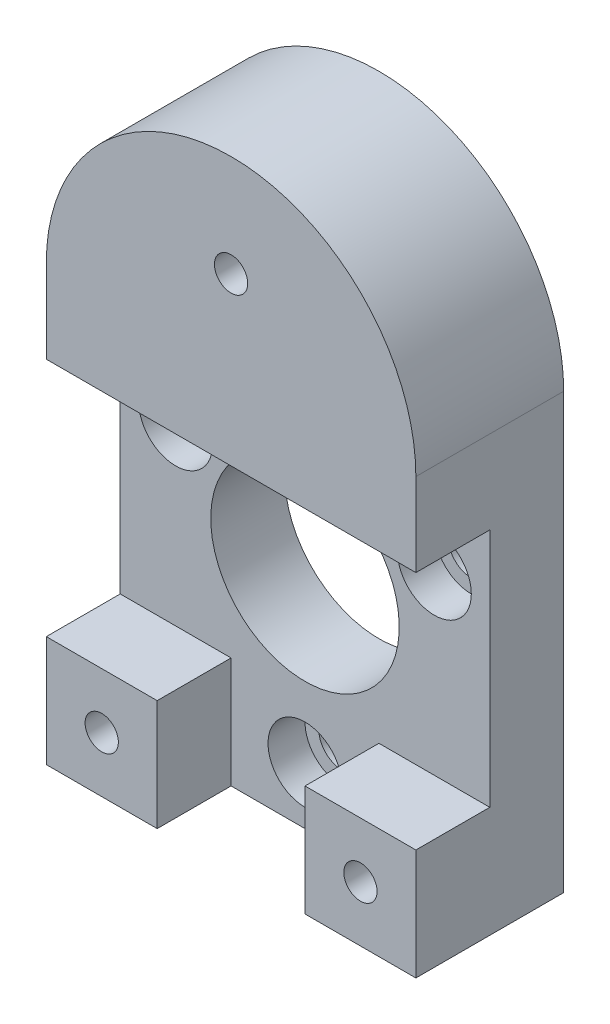
ISO-10303-21;
HEADER;
FILE_DESCRIPTION(('STEP AP214'),'2;1');
FILE_NAME('part.step','',(''),(''),'','','');
FILE_SCHEMA(('AUTOMOTIVE_DESIGN { 1 0 10303 214 1 1 1 1 }'));
ENDSEC;
DATA;
#1=APPLICATION_CONTEXT('core data for automotive mechanical design processes');
#2=APPLICATION_PROTOCOL_DEFINITION('international standard','automotive_design',2000,#1);
#3=PRODUCT_CONTEXT('',#1,'mechanical');
#4=PRODUCT('Part','Part','',(#3));
#5=PRODUCT_RELATED_PRODUCT_CATEGORY('part','',(#4));
#6=PRODUCT_DEFINITION_FORMATION('','',#4);
#7=PRODUCT_DEFINITION_CONTEXT('part definition',#1,'design');
#8=PRODUCT_DEFINITION('design','',#6,#7);
#9=PRODUCT_DEFINITION_SHAPE('','',#8);
#10=(LENGTH_UNIT() NAMED_UNIT(*) SI_UNIT(.MILLI.,.METRE.));
#11=(NAMED_UNIT(*) PLANE_ANGLE_UNIT() SI_UNIT($,.RADIAN.));
#12=(NAMED_UNIT(*) SI_UNIT($,.STERADIAN.) SOLID_ANGLE_UNIT());
#13=UNCERTAINTY_MEASURE_WITH_UNIT(LENGTH_MEASURE(1.E-05),#10,'distance_accuracy_value','');
#14=(GEOMETRIC_REPRESENTATION_CONTEXT(3) GLOBAL_UNCERTAINTY_ASSIGNED_CONTEXT((#13)) GLOBAL_UNIT_ASSIGNED_CONTEXT((#10,
#11,#12)) REPRESENTATION_CONTEXT('',''));
#15=CARTESIAN_POINT('',(0.,0.,0.));
#16=DIRECTION('',(0.,0.,1.));
#17=DIRECTION('',(1.,0.,0.));
#18=AXIS2_PLACEMENT_3D('',#15,#16,#17);
#19=CARTESIAN_POINT('',(0.,0.,28.));
#20=DIRECTION('',(0.,0.,-1.));
#21=DIRECTION('',(1.,0.,0.));
#22=AXIS2_PLACEMENT_3D('',#19,#20,#21);
#23=PLANE('',#22);
#24=CARTESIAN_POINT('',(0.,-9.,28.));
#25=DIRECTION('',(0.,0.,1.));
#26=DIRECTION('',(1.,0.,0.));
#27=AXIS2_PLACEMENT_3D('',#24,#25,#26);
#28=CIRCLE('',#27,2.);
#29=CARTESIAN_POINT('',(2.,-9.,28.));
#30=VERTEX_POINT('',#29);
#31=EDGE_CURVE('E351',#30,#30,#28,.T.);
#32=ORIENTED_EDGE('',*,*,#31,.F.);
#33=EDGE_LOOP('',(#32));
#34=FACE_BOUND('',#33,.T.);
#35=CARTESIAN_POINT('',(7.,3.49999999999994,28.));
#36=DIRECTION('',(0.,0.,1.));
#37=DIRECTION('',(1.,0.,0.));
#38=AXIS2_PLACEMENT_3D('',#35,#36,#37);
#39=CIRCLE('',#38,2.);
#40=CARTESIAN_POINT('',(9.,3.49999999999994,28.));
#41=VERTEX_POINT('',#40);
#42=EDGE_CURVE('E347',#41,#41,#39,.T.);
#43=ORIENTED_EDGE('',*,*,#42,.F.);
#44=EDGE_LOOP('',(#43));
#45=FACE_BOUND('',#44,.T.);
#46=CARTESIAN_POINT('',(-7.,3.49999999999994,28.));
#47=DIRECTION('',(0.,0.,1.));
#48=DIRECTION('',(1.,0.,0.));
#49=AXIS2_PLACEMENT_3D('',#46,#47,#48);
#50=CIRCLE('',#49,2.);
#51=CARTESIAN_POINT('',(-5.,3.49999999999994,28.));
#52=VERTEX_POINT('',#51);
#53=EDGE_CURVE('E344',#52,#52,#50,.T.);
#54=ORIENTED_EDGE('',*,*,#53,.F.);
#55=EDGE_LOOP('',(#54));
#56=FACE_BOUND('',#55,.T.);
#57=DIRECTION('',(-1.,0.,0.));
#58=VECTOR('',#57,1.);
#59=CARTESIAN_POINT('',(-10.,6.99999999999994,28.));
#60=LINE('',#59,#58);
#61=CARTESIAN_POINT('',(10.,6.99999999999994,28.));
#62=VERTEX_POINT('',#61);
#63=CARTESIAN_POINT('',(7.21110255092378,6.99999999999994,28.));
#64=VERTEX_POINT('',#63);
#65=EDGE_CURVE('E291',#62,#64,#60,.T.);
#66=ORIENTED_EDGE('',*,*,#65,.T.);
#67=CARTESIAN_POINT('',(0.,11.4999999999999,28.));
#68=DIRECTION('',(0.,0.,1.));
#69=DIRECTION('',(1.,0.,0.));
#70=AXIS2_PLACEMENT_3D('',#67,#68,#69);
#71=CIRCLE('',#70,8.49999999999644);
#72=CARTESIAN_POINT('',(3.46780218363991,3.73956521739389,28.));
#73=VERTEX_POINT('',#72);
#74=EDGE_CURVE('E298',#73,#64,#71,.T.);
#75=ORIENTED_EDGE('',*,*,#74,.F.);
#76=CARTESIAN_POINT('',(0.,0.,28.));
#77=DIRECTION('',(0.,0.,1.));
#78=DIRECTION('',(1.,0.,0.));
#79=AXIS2_PLACEMENT_3D('',#76,#77,#78);
#80=CIRCLE('',#79,5.1);
#81=CARTESIAN_POINT('',(-3.46780218363991,3.73956521739389,28.));
#82=VERTEX_POINT('',#81);
#83=EDGE_CURVE('E296',#82,#73,#80,.T.);
#84=ORIENTED_EDGE('',*,*,#83,.F.);
#85=CARTESIAN_POINT('',(-7.21110255092379,6.99999999999994,28.));
#86=VERTEX_POINT('',#85);
#87=EDGE_CURVE('E278',#86,#82,#71,.T.);
#88=ORIENTED_EDGE('',*,*,#87,.F.);
#89=CARTESIAN_POINT('',(-10.,6.99999999999994,28.));
#90=VERTEX_POINT('',#89);
#91=EDGE_CURVE('E287',#86,#90,#60,.T.);
#92=ORIENTED_EDGE('',*,*,#91,.T.);
#93=DIRECTION('',(0.,1.,0.));
#94=VECTOR('',#93,1.);
#95=CARTESIAN_POINT('',(-10.,11.4999999999999,28.));
#96=LINE('',#95,#94);
#97=CARTESIAN_POINT('',(-10.,-6.,28.));
#98=VERTEX_POINT('',#97);
#99=EDGE_CURVE('E348',#98,#90,#96,.T.);
#100=ORIENTED_EDGE('',*,*,#99,.F.);
#101=DIRECTION('',(-1.,0.,0.));
#102=VECTOR('',#101,1.);
#103=CARTESIAN_POINT('',(-10.,-6.,28.));
#104=LINE('',#103,#102);
#105=CARTESIAN_POINT('',(-4.,-6.00000000000001,28.));
#106=VERTEX_POINT('',#105);
#107=EDGE_CURVE('E419',#106,#98,#104,.T.);
#108=ORIENTED_EDGE('',*,*,#107,.F.);
#109=DIRECTION('',(0.,-1.,0.));
#110=VECTOR('',#109,1.);
#111=CARTESIAN_POINT('',(-4.,0.,28.));
#112=LINE('',#111,#110);
#113=CARTESIAN_POINT('',(-4.,-12.,28.));
#114=VERTEX_POINT('',#113);
#115=EDGE_CURVE('E358',#106,#114,#112,.T.);
#116=ORIENTED_EDGE('',*,*,#115,.T.);
#117=DIRECTION('',(-1.,0.,0.));
#118=VECTOR('',#117,1.);
#119=CARTESIAN_POINT('',(0.,-12.,28.));
#120=LINE('',#119,#118);
#121=CARTESIAN_POINT('',(4.,-12.,28.));
#122=VERTEX_POINT('',#121);
#123=EDGE_CURVE('E378',#122,#114,#120,.T.);
#124=ORIENTED_EDGE('',*,*,#123,.F.);
#125=DIRECTION('',(0.,-1.,0.));
#126=VECTOR('',#125,1.);
#127=CARTESIAN_POINT('',(4.,0.,28.));
#128=LINE('',#127,#126);
#129=CARTESIAN_POINT('',(4.,-6.,28.));
#130=VERTEX_POINT('',#129);
#131=EDGE_CURVE('E374',#130,#122,#128,.T.);
#132=ORIENTED_EDGE('',*,*,#131,.F.);
#133=CARTESIAN_POINT('',(10.,-6.,28.));
#134=VERTEX_POINT('',#133);
#135=EDGE_CURVE('E416',#134,#130,#104,.T.);
#136=ORIENTED_EDGE('',*,*,#135,.F.);
#137=DIRECTION('',(0.,-1.,0.));
#138=VECTOR('',#137,1.);
#139=CARTESIAN_POINT('',(10.,11.4999999999999,28.));
#140=LINE('',#139,#138);
#141=EDGE_CURVE('E404',#62,#134,#140,.T.);
#142=ORIENTED_EDGE('',*,*,#141,.F.);
#143=EDGE_LOOP('',(#66,#75,#84,#88,#92,#100,#108,#116,#124,#132,#136,#142));
#144=FACE_BOUND('',#143,.T.);
#145=ADVANCED_FACE('F157',(#34,#45,#56,#144),#23,.F.);
#146=CARTESIAN_POINT('',(-10.,-6.,52.8806130178211));
#147=DIRECTION('',(0.,-1.,0.));
#148=DIRECTION('',(1.,0.,0.));
#149=AXIS2_PLACEMENT_3D('',#146,#147,#148);
#150=PLANE('',#149);
#151=DIRECTION('',(0.,0.,1.));
#152=VECTOR('',#151,1.);
#153=CARTESIAN_POINT('',(-4.,-6.00000000000001,18.));
#154=LINE('',#153,#152);
#155=CARTESIAN_POINT('',(-4.,-6.00000000000001,32.));
#156=VERTEX_POINT('',#155);
#157=EDGE_CURVE('E372',#106,#156,#154,.T.);
#158=ORIENTED_EDGE('',*,*,#157,.F.);
#159=ORIENTED_EDGE('',*,*,#107,.T.);
#160=DIRECTION('',(0.,0.,-1.));
#161=VECTOR('',#160,1.);
#162=CARTESIAN_POINT('',(-10.,-6.,52.8806130178211));
#163=LINE('',#162,#161);
#164=CARTESIAN_POINT('',(-10.,-6.,32.));
#165=VERTEX_POINT('',#164);
#166=EDGE_CURVE('E410',#165,#98,#163,.T.);
#167=ORIENTED_EDGE('',*,*,#166,.F.);
#168=DIRECTION('',(-1.,0.,0.));
#169=VECTOR('',#168,1.);
#170=CARTESIAN_POINT('',(-10.,-6.,32.));
#171=LINE('',#170,#169);
#172=EDGE_CURVE('E396',#156,#165,#171,.T.);
#173=ORIENTED_EDGE('',*,*,#172,.F.);
#174=EDGE_LOOP('',(#158,#159,#167,#173));
#175=FACE_BOUND('',#174,.T.);
#176=ADVANCED_FACE('F459',(#175),#150,.F.);
#177=CARTESIAN_POINT('',(0.,0.,32.));
#178=DIRECTION('',(0.,0.,-1.));
#179=DIRECTION('',(1.,0.,0.));
#180=AXIS2_PLACEMENT_3D('',#177,#178,#179);
#181=PLANE('',#180);
#182=CARTESIAN_POINT('',(-7.,-9.,32.));
#183=DIRECTION('',(0.,0.,-1.));
#184=DIRECTION('',(-1.,0.,0.));
#185=AXIS2_PLACEMENT_3D('',#182,#183,#184);
#186=CIRCLE('',#185,0.900000000000001);
#187=CARTESIAN_POINT('',(-7.9,-9.,32.));
#188=VERTEX_POINT('',#187);
#189=EDGE_CURVE('E516',#188,#188,#186,.T.);
#190=ORIENTED_EDGE('',*,*,#189,.T.);
#191=EDGE_LOOP('',(#190));
#192=FACE_BOUND('',#191,.T.);
#193=DIRECTION('',(0.,-1.,0.));
#194=VECTOR('',#193,1.);
#195=CARTESIAN_POINT('',(-4.,0.,32.));
#196=LINE('',#195,#194);
#197=CARTESIAN_POINT('',(-4.,-12.,32.));
#198=VERTEX_POINT('',#197);
#199=EDGE_CURVE('E368',#156,#198,#196,.T.);
#200=ORIENTED_EDGE('',*,*,#199,.F.);
#201=ORIENTED_EDGE('',*,*,#172,.T.);
#202=DIRECTION('',(0.,-1.,0.));
#203=VECTOR('',#202,1.);
#204=CARTESIAN_POINT('',(-10.,-6.,32.));
#205=LINE('',#204,#203);
#206=CARTESIAN_POINT('',(-10.,-12.,32.));
#207=VERTEX_POINT('',#206);
#208=EDGE_CURVE('E401',#165,#207,#205,.T.);
#209=ORIENTED_EDGE('',*,*,#208,.T.);
#210=DIRECTION('',(1.,0.,0.));
#211=VECTOR('',#210,1.);
#212=CARTESIAN_POINT('',(-10.,-12.,32.));
#213=LINE('',#212,#211);
#214=EDGE_CURVE('E397',#207,#198,#213,.T.);
#215=ORIENTED_EDGE('',*,*,#214,.T.);
#216=EDGE_LOOP('',(#200,#201,#209,#215));
#217=FACE_BOUND('',#216,.T.);
#218=ADVANCED_FACE('F433',(#192,#217),#181,.F.);
#219=CARTESIAN_POINT('',(0.,0.,24.));
#220=DIRECTION('',(0.,0.,-1.));
#221=DIRECTION('',(1.,0.,0.));
#222=AXIS2_PLACEMENT_3D('',#219,#220,#221);
#223=PLANE('',#222);
#224=CARTESIAN_POINT('',(-7.,-9.,24.));
#225=DIRECTION('',(0.,0.,-1.));
#226=DIRECTION('',(-1.,0.,0.));
#227=AXIS2_PLACEMENT_3D('',#224,#225,#226);
#228=CIRCLE('',#227,0.900000000000001);
#229=CARTESIAN_POINT('',(-7.9,-9.,24.));
#230=VERTEX_POINT('',#229);
#231=EDGE_CURVE('E513',#230,#230,#228,.T.);
#232=ORIENTED_EDGE('',*,*,#231,.F.);
#233=EDGE_LOOP('',(#232));
#234=FACE_BOUND('',#233,.T.);
#235=CARTESIAN_POINT('',(7.,-9.,24.));
#236=DIRECTION('',(0.,0.,-1.));
#237=DIRECTION('',(-1.,0.,0.));
#238=AXIS2_PLACEMENT_3D('',#235,#236,#237);
#239=CIRCLE('',#238,0.899999999999999);
#240=CARTESIAN_POINT('',(6.1,-9.,24.));
#241=VERTEX_POINT('',#240);
#242=EDGE_CURVE('E522',#241,#241,#239,.T.);
#243=ORIENTED_EDGE('',*,*,#242,.F.);
#244=EDGE_LOOP('',(#243));
#245=FACE_BOUND('',#244,.T.);
#246=CARTESIAN_POINT('',(0.,-9.,24.));
#247=DIRECTION('',(0.,0.,-1.));
#248=DIRECTION('',(-1.,0.,0.));
#249=AXIS2_PLACEMENT_3D('',#246,#247,#248);
#250=CIRCLE('',#249,1.25);
#251=CARTESIAN_POINT('',(-1.25,-9.,24.));
#252=VERTEX_POINT('',#251);
#253=EDGE_CURVE('E354',#252,#252,#250,.T.);
#254=ORIENTED_EDGE('',*,*,#253,.F.);
#255=EDGE_LOOP('',(#254));
#256=FACE_BOUND('',#255,.T.);
#257=CARTESIAN_POINT('',(0.,11.4999999999999,24.));
#258=DIRECTION('',(0.,0.,1.));
#259=DIRECTION('',(1.,0.,0.));
#260=AXIS2_PLACEMENT_3D('',#257,#258,#259);
#261=CIRCLE('',#260,8.49999999999644);
#262=CARTESIAN_POINT('',(3.46780218363991,3.73956521739389,24.));
#263=VERTEX_POINT('',#262);
#264=CARTESIAN_POINT('',(-3.46780218363991,3.73956521739389,24.));
#265=VERTEX_POINT('',#264);
#266=EDGE_CURVE('E331',#263,#265,#261,.T.);
#267=ORIENTED_EDGE('',*,*,#266,.T.);
#268=CARTESIAN_POINT('',(0.,0.,24.));
#269=DIRECTION('',(0.,0.,1.));
#270=DIRECTION('',(1.,0.,0.));
#271=AXIS2_PLACEMENT_3D('',#268,#269,#270);
#272=CIRCLE('',#271,5.1);
#273=EDGE_CURVE('E328',#265,#263,#272,.T.);
#274=ORIENTED_EDGE('',*,*,#273,.T.);
#275=EDGE_LOOP('',(#267,#274));
#276=FACE_BOUND('',#275,.T.);
#277=CARTESIAN_POINT('',(-7.,3.49999999999994,24.));
#278=DIRECTION('',(0.,0.,1.));
#279=DIRECTION('',(1.,0.,0.));
#280=AXIS2_PLACEMENT_3D('',#277,#278,#279);
#281=CIRCLE('',#280,1.25);
#282=CARTESIAN_POINT('',(-5.75,3.49999999999994,24.));
#283=VERTEX_POINT('',#282);
#284=EDGE_CURVE('E325',#283,#283,#281,.T.);
#285=ORIENTED_EDGE('',*,*,#284,.T.);
#286=EDGE_LOOP('',(#285));
#287=FACE_BOUND('',#286,.T.);
#288=CARTESIAN_POINT('',(0.,11.4999999999999,24.));
#289=DIRECTION('',(0.,0.,1.));
#290=DIRECTION('',(1.,0.,0.));
#291=AXIS2_PLACEMENT_3D('',#288,#289,#290);
#292=CIRCLE('',#291,10.);
#293=CARTESIAN_POINT('',(-10.,11.4999999999999,24.));
#294=VERTEX_POINT('',#293);
#295=CARTESIAN_POINT('',(10.,11.4999999999999,24.));
#296=VERTEX_POINT('',#295);
#297=EDGE_CURVE('E311',#294,#296,#292,.F.);
#298=ORIENTED_EDGE('',*,*,#297,.T.);
#299=DIRECTION('',(0.,1.,0.));
#300=VECTOR('',#299,1.);
#301=CARTESIAN_POINT('',(10.,-6.,24.));
#302=LINE('',#301,#300);
#303=CARTESIAN_POINT('',(10.,-12.,24.));
#304=VERTEX_POINT('',#303);
#305=EDGE_CURVE('E166',#304,#296,#302,.T.);
#306=ORIENTED_EDGE('',*,*,#305,.F.);
#307=DIRECTION('',(-1.,0.,0.));
#308=VECTOR('',#307,1.);
#309=CARTESIAN_POINT('',(-10.,-12.,24.));
#310=LINE('',#309,#308);
#311=CARTESIAN_POINT('',(-10.,-12.,24.));
#312=VERTEX_POINT('',#311);
#313=EDGE_CURVE('E389',#304,#312,#310,.T.);
#314=ORIENTED_EDGE('',*,*,#313,.T.);
#315=DIRECTION('',(0.,1.,0.));
#316=VECTOR('',#315,1.);
#317=CARTESIAN_POINT('',(-10.,-6.,24.));
#318=LINE('',#317,#316);
#319=EDGE_CURVE('E14',#312,#294,#318,.T.);
#320=ORIENTED_EDGE('',*,*,#319,.T.);
#321=EDGE_LOOP('',(#298,#306,#314,#320));
#322=FACE_BOUND('',#321,.T.);
#323=CARTESIAN_POINT('',(7.,3.49999999999994,24.));
#324=DIRECTION('',(0.,0.,1.));
#325=DIRECTION('',(1.,0.,0.));
#326=AXIS2_PLACEMENT_3D('',#323,#324,#325);
#327=CIRCLE('',#326,1.25);
#328=CARTESIAN_POINT('',(8.25,3.49999999999994,24.));
#329=VERTEX_POINT('',#328);
#330=EDGE_CURVE('E316',#329,#329,#327,.T.);
#331=ORIENTED_EDGE('',*,*,#330,.T.);
#332=EDGE_LOOP('',(#331));
#333=FACE_BOUND('',#332,.T.);
#334=ADVANCED_FACE('F429',(#234,#245,#256,#276,#287,#322,#333),#223,.T.);
#335=CARTESIAN_POINT('',(0.,0.,32.));
#336=DIRECTION('',(0.,0.,-1.));
#337=DIRECTION('',(1.,0.,0.));
#338=AXIS2_PLACEMENT_3D('',#335,#336,#337);
#339=PLANE('',#338);
#340=CARTESIAN_POINT('',(0.,16.,32.));
#341=DIRECTION('',(0.,0.,-1.));
#342=DIRECTION('',(-1.,0.,0.));
#343=AXIS2_PLACEMENT_3D('',#340,#341,#342);
#344=CIRCLE('',#343,0.900000000000001);
#345=CARTESIAN_POINT('',(-0.900000000000001,16.,32.));
#346=VERTEX_POINT('',#345);
#347=EDGE_CURVE('E507',#346,#346,#344,.T.);
#348=ORIENTED_EDGE('',*,*,#347,.T.);
#349=EDGE_LOOP('',(#348));
#350=FACE_BOUND('',#349,.T.);
#351=CARTESIAN_POINT('',(0.,11.4999999999999,32.));
#352=DIRECTION('',(0.,0.,-1.));
#353=DIRECTION('',(-1.,0.,0.));
#354=AXIS2_PLACEMENT_3D('',#351,#352,#353);
#355=CIRCLE('',#354,10.);
#356=CARTESIAN_POINT('',(-10.,11.4999999999999,32.));
#357=VERTEX_POINT('',#356);
#358=CARTESIAN_POINT('',(10.,11.4999999999999,32.));
#359=VERTEX_POINT('',#358);
#360=EDGE_CURVE('E313',#357,#359,#355,.T.);
#361=ORIENTED_EDGE('',*,*,#360,.F.);
#362=DIRECTION('',(0.,-1.,0.));
#363=VECTOR('',#362,1.);
#364=CARTESIAN_POINT('',(-10.,11.4999999999999,32.));
#365=LINE('',#364,#363);
#366=CARTESIAN_POINT('',(-10.,6.99999999999994,32.));
#367=VERTEX_POINT('',#366);
#368=EDGE_CURVE('E504',#357,#367,#365,.T.);
#369=ORIENTED_EDGE('',*,*,#368,.T.);
#370=DIRECTION('',(1.,0.,0.));
#371=VECTOR('',#370,1.);
#372=CARTESIAN_POINT('',(-10.,6.99999999999994,32.));
#373=LINE('',#372,#371);
#374=CARTESIAN_POINT('',(10.,6.99999999999994,32.));
#375=VERTEX_POINT('',#374);
#376=EDGE_CURVE('E505',#367,#375,#373,.T.);
#377=ORIENTED_EDGE('',*,*,#376,.T.);
#378=DIRECTION('',(0.,1.,0.));
#379=VECTOR('',#378,1.);
#380=CARTESIAN_POINT('',(10.,11.4999999999999,32.));
#381=LINE('',#380,#379);
#382=EDGE_CURVE('E501',#375,#359,#381,.T.);
#383=ORIENTED_EDGE('',*,*,#382,.T.);
#384=EDGE_LOOP('',(#361,#369,#377,#383));
#385=FACE_BOUND('',#384,.T.);
#386=ADVANCED_FACE('F432',(#350,#385),#339,.F.);
#387=CARTESIAN_POINT('',(10.,-6.,24.));
#388=DIRECTION('',(-1.,0.,0.));
#389=DIRECTION('',(0.,0.,-1.));
#390=AXIS2_PLACEMENT_3D('',#387,#388,#389);
#391=PLANE('',#390);
#392=ORIENTED_EDGE('',*,*,#305,.T.);
#393=DIRECTION('',(0.,0.,1.));
#394=VECTOR('',#393,1.);
#395=CARTESIAN_POINT('',(10.,11.4999999999999,-1.30316185775996));
#396=LINE('',#395,#394);
#397=EDGE_CURVE('E320',#296,#359,#396,.T.);
#398=ORIENTED_EDGE('',*,*,#397,.T.);
#399=ORIENTED_EDGE('',*,*,#382,.F.);
#400=DIRECTION('',(0.,0.,-1.));
#401=VECTOR('',#400,1.);
#402=CARTESIAN_POINT('',(10.,6.99999999999994,52.5));
#403=LINE('',#402,#401);
#404=EDGE_CURVE('E182',#375,#62,#403,.T.);
#405=ORIENTED_EDGE('',*,*,#404,.T.);
#406=ORIENTED_EDGE('',*,*,#141,.T.);
#407=DIRECTION('',(0.,0.,-1.));
#408=VECTOR('',#407,1.);
#409=CARTESIAN_POINT('',(10.,-6.,52.8806130178211));
#410=LINE('',#409,#408);
#411=CARTESIAN_POINT('',(10.,-6.,32.));
#412=VERTEX_POINT('',#411);
#413=EDGE_CURVE('E408',#412,#134,#410,.T.);
#414=ORIENTED_EDGE('',*,*,#413,.F.);
#415=DIRECTION('',(0.,1.,0.));
#416=VECTOR('',#415,1.);
#417=CARTESIAN_POINT('',(10.,-6.,32.));
#418=LINE('',#417,#416);
#419=CARTESIAN_POINT('',(10.,-12.,32.));
#420=VERTEX_POINT('',#419);
#421=EDGE_CURVE('E393',#420,#412,#418,.T.);
#422=ORIENTED_EDGE('',*,*,#421,.F.);
#423=DIRECTION('',(0.,0.,-1.));
#424=VECTOR('',#423,1.);
#425=CARTESIAN_POINT('',(10.,-12.,52.8806130178211));
#426=LINE('',#425,#424);
#427=EDGE_CURVE('E406',#420,#304,#426,.T.);
#428=ORIENTED_EDGE('',*,*,#427,.T.);
#429=EDGE_LOOP('',(#392,#398,#399,#405,#406,#414,#422,#428));
#430=FACE_BOUND('',#429,.T.);
#431=ADVANCED_FACE('F159',(#430),#391,.F.);
#432=CARTESIAN_POINT('',(-10.,-6.,24.));
#433=DIRECTION('',(-1.,0.,0.));
#434=DIRECTION('',(0.,0.,-1.));
#435=AXIS2_PLACEMENT_3D('',#432,#433,#434);
#436=PLANE('',#435);
#437=ORIENTED_EDGE('',*,*,#99,.T.);
#438=DIRECTION('',(0.,0.,-1.));
#439=VECTOR('',#438,1.);
#440=CARTESIAN_POINT('',(-10.,6.99999999999994,52.5));
#441=LINE('',#440,#439);
#442=EDGE_CURVE('E174',#367,#90,#441,.T.);
#443=ORIENTED_EDGE('',*,*,#442,.F.);
#444=ORIENTED_EDGE('',*,*,#368,.F.);
#445=DIRECTION('',(0.,0.,1.));
#446=VECTOR('',#445,1.);
#447=CARTESIAN_POINT('',(-10.,11.4999999999999,-1.30316185775996));
#448=LINE('',#447,#446);
#449=EDGE_CURVE('E317',#294,#357,#448,.T.);
#450=ORIENTED_EDGE('',*,*,#449,.F.);
#451=ORIENTED_EDGE('',*,*,#319,.F.);
#452=DIRECTION('',(0.,0.,-1.));
#453=VECTOR('',#452,1.);
#454=CARTESIAN_POINT('',(-10.,-12.,52.8806130178211));
#455=LINE('',#454,#453);
#456=EDGE_CURVE('E392',#207,#312,#455,.T.);
#457=ORIENTED_EDGE('',*,*,#456,.F.);
#458=ORIENTED_EDGE('',*,*,#208,.F.);
#459=ORIENTED_EDGE('',*,*,#166,.T.);
#460=EDGE_LOOP('',(#437,#443,#444,#450,#451,#457,#458,#459));
#461=FACE_BOUND('',#460,.T.);
#462=ADVANCED_FACE('F583',(#461),#436,.T.);
#463=CARTESIAN_POINT('',(0.,11.4999999999999,24.));
#464=DIRECTION('',(0.,0.,1.));
#465=DIRECTION('',(-1.,0.,0.));
#466=AXIS2_PLACEMENT_3D('',#463,#464,#465);
#467=CYLINDRICAL_SURFACE('',#466,8.49999999999644);
#468=ORIENTED_EDGE('',*,*,#87,.T.);
#469=DIRECTION('',(0.,0.,1.));
#470=VECTOR('',#469,1.);
#471=CARTESIAN_POINT('',(-3.46780218363991,3.73956521739389,24.));
#472=LINE('',#471,#470);
#473=EDGE_CURVE('E336',#265,#82,#472,.T.);
#474=ORIENTED_EDGE('',*,*,#473,.F.);
#475=ORIENTED_EDGE('',*,*,#266,.F.);
#476=DIRECTION('',(0.,0.,1.));
#477=VECTOR('',#476,1.);
#478=CARTESIAN_POINT('',(3.46780218363991,3.73956521739389,24.));
#479=LINE('',#478,#477);
#480=EDGE_CURVE('E334',#263,#73,#479,.T.);
#481=ORIENTED_EDGE('',*,*,#480,.T.);
#482=ORIENTED_EDGE('',*,*,#74,.T.);
#483=DIRECTION('',(0.,0.,-1.));
#484=VECTOR('',#483,1.);
#485=CARTESIAN_POINT('',(7.21110255092378,6.99999999999994,53.0416305603325));
#486=LINE('',#485,#484);
#487=CARTESIAN_POINT('',(7.21110255092378,6.99999999999994,29.));
#488=VERTEX_POINT('',#487);
#489=EDGE_CURVE('E284',#64,#488,#486,.F.);
#490=ORIENTED_EDGE('',*,*,#489,.T.);
#491=CARTESIAN_POINT('',(0.,11.4999999999999,29.));
#492=DIRECTION('',(0.,0.,-1.));
#493=DIRECTION('',(-1.,0.,0.));
#494=AXIS2_PLACEMENT_3D('',#491,#492,#493);
#495=CIRCLE('',#494,8.49999999999644);
#496=CARTESIAN_POINT('',(-7.21110255092379,6.99999999999994,29.));
#497=VERTEX_POINT('',#496);
#498=EDGE_CURVE('E282',#497,#488,#495,.T.);
#499=ORIENTED_EDGE('',*,*,#498,.F.);
#500=DIRECTION('',(0.,0.,-1.));
#501=VECTOR('',#500,1.);
#502=CARTESIAN_POINT('',(-7.21110255092379,6.99999999999994,53.0416305603325));
#503=LINE('',#502,#501);
#504=EDGE_CURVE('E275',#497,#86,#503,.T.);
#505=ORIENTED_EDGE('',*,*,#504,.T.);
#506=EDGE_LOOP('',(#468,#474,#475,#481,#482,#490,#499,#505));
#507=FACE_BOUND('',#506,.T.);
#508=ADVANCED_FACE('F276',(#507),#467,.F.);
#509=CARTESIAN_POINT('',(0.,0.,24.));
#510=DIRECTION('',(0.,0.,1.));
#511=DIRECTION('',(-1.,0.,0.));
#512=AXIS2_PLACEMENT_3D('',#509,#510,#511);
#513=CYLINDRICAL_SURFACE('',#512,5.1);
#514=ORIENTED_EDGE('',*,*,#83,.T.);
#515=ORIENTED_EDGE('',*,*,#480,.F.);
#516=ORIENTED_EDGE('',*,*,#273,.F.);
#517=ORIENTED_EDGE('',*,*,#473,.T.);
#518=EDGE_LOOP('',(#514,#515,#516,#517));
#519=FACE_BOUND('',#518,.T.);
#520=ADVANCED_FACE('F424',(#519),#513,.F.);
#521=CARTESIAN_POINT('',(-7.,3.49999999999994,24.));
#522=DIRECTION('',(0.,0.,1.));
#523=DIRECTION('',(-1.,0.,0.));
#524=AXIS2_PLACEMENT_3D('',#521,#522,#523);
#525=CYLINDRICAL_SURFACE('',#524,1.25);
#526=CARTESIAN_POINT('',(-7.,3.49999999999994,26.));
#527=DIRECTION('',(0.,0.,1.));
#528=DIRECTION('',(1.,0.,0.));
#529=AXIS2_PLACEMENT_3D('',#526,#527,#528);
#530=CIRCLE('',#529,1.25);
#531=CARTESIAN_POINT('',(-5.75,3.49999999999994,26.));
#532=VERTEX_POINT('',#531);
#533=EDGE_CURVE('E312',#532,#532,#530,.T.);
#534=ORIENTED_EDGE('',*,*,#533,.T.);
#535=EDGE_LOOP('',(#534));
#536=FACE_BOUND('',#535,.T.);
#537=ORIENTED_EDGE('',*,*,#284,.F.);
#538=EDGE_LOOP('',(#537));
#539=FACE_BOUND('',#538,.T.);
#540=ADVANCED_FACE('F446',(#536,#539),#525,.F.);
#541=CARTESIAN_POINT('',(7.,3.49999999999994,24.));
#542=DIRECTION('',(0.,0.,1.));
#543=DIRECTION('',(-1.,0.,0.));
#544=AXIS2_PLACEMENT_3D('',#541,#542,#543);
#545=CYLINDRICAL_SURFACE('',#544,1.25);
#546=CARTESIAN_POINT('',(7.,3.49999999999994,26.));
#547=DIRECTION('',(0.,0.,1.));
#548=DIRECTION('',(1.,0.,0.));
#549=AXIS2_PLACEMENT_3D('',#546,#547,#548);
#550=CIRCLE('',#549,1.25);
#551=CARTESIAN_POINT('',(8.25,3.49999999999994,26.));
#552=VERTEX_POINT('',#551);
#553=EDGE_CURVE('E308',#552,#552,#550,.T.);
#554=ORIENTED_EDGE('',*,*,#553,.T.);
#555=EDGE_LOOP('',(#554));
#556=FACE_BOUND('',#555,.T.);
#557=ORIENTED_EDGE('',*,*,#330,.F.);
#558=EDGE_LOOP('',(#557));
#559=FACE_BOUND('',#558,.T.);
#560=ADVANCED_FACE('F443',(#556,#559),#545,.F.);
#561=CARTESIAN_POINT('',(0.,11.4999999999999,-1.30316185775996));
#562=DIRECTION('',(0.,0.,1.));
#563=DIRECTION('',(-1.,0.,0.));
#564=AXIS2_PLACEMENT_3D('',#561,#562,#563);
#565=CYLINDRICAL_SURFACE('',#564,10.);
#566=ORIENTED_EDGE('',*,*,#449,.T.);
#567=ORIENTED_EDGE('',*,*,#360,.T.);
#568=ORIENTED_EDGE('',*,*,#397,.F.);
#569=ORIENTED_EDGE('',*,*,#297,.F.);
#570=EDGE_LOOP('',(#566,#567,#568,#569));
#571=FACE_BOUND('',#570,.T.);
#572=ADVANCED_FACE('F445',(#571),#565,.T.);
#573=CARTESIAN_POINT('',(0.,0.,29.));
#574=DIRECTION('',(0.,0.,1.));
#575=DIRECTION('',(-1.,0.,0.));
#576=AXIS2_PLACEMENT_3D('',#573,#574,#575);
#577=PLANE('',#576);
#578=CARTESIAN_POINT('',(0.,11.4999999999999,29.));
#579=DIRECTION('',(0.,0.,1.));
#580=DIRECTION('',(1.,0.,0.));
#581=AXIS2_PLACEMENT_3D('',#578,#579,#580);
#582=CIRCLE('',#581,2.55);
#583=CARTESIAN_POINT('',(2.55000000000001,11.4999999999999,29.));
#584=VERTEX_POINT('',#583);
#585=EDGE_CURVE('E494',#584,#584,#582,.T.);
#586=ORIENTED_EDGE('',*,*,#585,.T.);
#587=EDGE_LOOP('',(#586));
#588=FACE_BOUND('',#587,.T.);
#589=CARTESIAN_POINT('',(0.,16.,29.));
#590=DIRECTION('',(0.,0.,-1.));
#591=DIRECTION('',(-1.,0.,0.));
#592=AXIS2_PLACEMENT_3D('',#589,#590,#591);
#593=CIRCLE('',#592,0.900000000000001);
#594=CARTESIAN_POINT('',(-0.900000000000001,16.,29.));
#595=VERTEX_POINT('',#594);
#596=EDGE_CURVE('E161',#595,#595,#593,.T.);
#597=ORIENTED_EDGE('',*,*,#596,.F.);
#598=EDGE_LOOP('',(#597));
#599=FACE_BOUND('',#598,.T.);
#600=ORIENTED_EDGE('',*,*,#498,.T.);
#601=DIRECTION('',(-1.,0.,0.));
#602=VECTOR('',#601,1.);
#603=CARTESIAN_POINT('',(-10.,6.99999999999994,29.));
#604=LINE('',#603,#602);
#605=EDGE_CURVE('E283',#488,#497,#604,.T.);
#606=ORIENTED_EDGE('',*,*,#605,.T.);
#607=EDGE_LOOP('',(#600,#606));
#608=FACE_BOUND('',#607,.T.);
#609=ADVANCED_FACE('F453',(#588,#599,#608),#577,.F.);
#610=CARTESIAN_POINT('',(7.,3.49999999999994,18.3431457505076));
#611=DIRECTION('',(0.,0.,1.));
#612=DIRECTION('',(-1.,0.,0.));
#613=AXIS2_PLACEMENT_3D('',#610,#611,#612);
#614=CYLINDRICAL_SURFACE('',#613,2.);
#615=ORIENTED_EDGE('',*,*,#42,.T.);
#616=EDGE_LOOP('',(#615));
#617=FACE_BOUND('',#616,.T.);
#618=CARTESIAN_POINT('',(7.,3.49999999999994,26.));
#619=DIRECTION('',(0.,0.,1.));
#620=DIRECTION('',(1.,0.,0.));
#621=AXIS2_PLACEMENT_3D('',#618,#619,#620);
#622=CIRCLE('',#621,2.);
#623=CARTESIAN_POINT('',(9.,3.49999999999994,26.));
#624=VERTEX_POINT('',#623);
#625=EDGE_CURVE('E297',#624,#624,#622,.T.);
#626=ORIENTED_EDGE('',*,*,#625,.F.);
#627=EDGE_LOOP('',(#626));
#628=FACE_BOUND('',#627,.T.);
#629=ADVANCED_FACE('F483',(#617,#628),#614,.F.);
#630=CARTESIAN_POINT('',(0.,0.,26.));
#631=DIRECTION('',(0.,0.,-1.));
#632=DIRECTION('',(1.,0.,0.));
#633=AXIS2_PLACEMENT_3D('',#630,#631,#632);
#634=PLANE('',#633);
#635=ORIENTED_EDGE('',*,*,#553,.F.);
#636=EDGE_LOOP('',(#635));
#637=FACE_BOUND('',#636,.T.);
#638=ORIENTED_EDGE('',*,*,#625,.T.);
#639=EDGE_LOOP('',(#638));
#640=FACE_BOUND('',#639,.T.);
#641=ADVANCED_FACE('F475',(#637,#640),#634,.F.);
#642=CARTESIAN_POINT('',(-7.,3.49999999999994,18.3431457505076));
#643=DIRECTION('',(0.,0.,1.));
#644=DIRECTION('',(-1.,0.,0.));
#645=AXIS2_PLACEMENT_3D('',#642,#643,#644);
#646=CYLINDRICAL_SURFACE('',#645,2.);
#647=ORIENTED_EDGE('',*,*,#53,.T.);
#648=EDGE_LOOP('',(#647));
#649=FACE_BOUND('',#648,.T.);
#650=CARTESIAN_POINT('',(-7.,3.49999999999994,26.));
#651=DIRECTION('',(0.,0.,1.));
#652=DIRECTION('',(1.,0.,0.));
#653=AXIS2_PLACEMENT_3D('',#650,#651,#652);
#654=CIRCLE('',#653,2.);
#655=CARTESIAN_POINT('',(-5.,3.49999999999994,26.));
#656=VERTEX_POINT('',#655);
#657=EDGE_CURVE('E301',#656,#656,#654,.T.);
#658=ORIENTED_EDGE('',*,*,#657,.F.);
#659=EDGE_LOOP('',(#658));
#660=FACE_BOUND('',#659,.T.);
#661=ADVANCED_FACE('F471',(#649,#660),#646,.F.);
#662=CARTESIAN_POINT('',(0.,0.,26.));
#663=DIRECTION('',(0.,0.,-1.));
#664=DIRECTION('',(1.,0.,0.));
#665=AXIS2_PLACEMENT_3D('',#662,#663,#664);
#666=PLANE('',#665);
#667=ORIENTED_EDGE('',*,*,#533,.F.);
#668=EDGE_LOOP('',(#667));
#669=FACE_BOUND('',#668,.T.);
#670=ORIENTED_EDGE('',*,*,#657,.T.);
#671=EDGE_LOOP('',(#670));
#672=FACE_BOUND('',#671,.T.);
#673=ADVANCED_FACE('F474',(#669,#672),#666,.F.);
#674=CARTESIAN_POINT('',(-10.,-12.,52.8806130178211));
#675=DIRECTION('',(0.,1.,0.));
#676=DIRECTION('',(-1.,0.,0.));
#677=AXIS2_PLACEMENT_3D('',#674,#675,#676);
#678=PLANE('',#677);
#679=ORIENTED_EDGE('',*,*,#123,.T.);
#680=DIRECTION('',(0.,0.,1.));
#681=VECTOR('',#680,1.);
#682=CARTESIAN_POINT('',(-4.,-12.,18.));
#683=LINE('',#682,#681);
#684=EDGE_CURVE('E381',#114,#198,#683,.T.);
#685=ORIENTED_EDGE('',*,*,#684,.T.);
#686=ORIENTED_EDGE('',*,*,#214,.F.);
#687=ORIENTED_EDGE('',*,*,#456,.T.);
#688=ORIENTED_EDGE('',*,*,#313,.F.);
#689=ORIENTED_EDGE('',*,*,#427,.F.);
#690=CARTESIAN_POINT('',(4.,-12.,32.));
#691=VERTEX_POINT('',#690);
#692=EDGE_CURVE('E412',#691,#420,#213,.T.);
#693=ORIENTED_EDGE('',*,*,#692,.F.);
#694=DIRECTION('',(0.,0.,1.));
#695=VECTOR('',#694,1.);
#696=CARTESIAN_POINT('',(4.,-12.,18.));
#697=LINE('',#696,#695);
#698=EDGE_CURVE('E376',#122,#691,#697,.T.);
#699=ORIENTED_EDGE('',*,*,#698,.F.);
#700=EDGE_LOOP('',(#679,#685,#686,#687,#688,#689,#693,#699));
#701=FACE_BOUND('',#700,.T.);
#702=ADVANCED_FACE('F479',(#701),#678,.F.);
#703=CARTESIAN_POINT('',(4.,-6.,32.));
#704=VERTEX_POINT('',#703);
#705=EDGE_CURVE('E398',#412,#704,#171,.T.);
#706=ORIENTED_EDGE('',*,*,#705,.F.);
#707=ORIENTED_EDGE('',*,*,#413,.T.);
#708=ORIENTED_EDGE('',*,*,#135,.T.);
#709=DIRECTION('',(0.,0.,1.));
#710=VECTOR('',#709,1.);
#711=CARTESIAN_POINT('',(4.,-6.,18.));
#712=LINE('',#711,#710);
#713=EDGE_CURVE('E371',#130,#704,#712,.T.);
#714=ORIENTED_EDGE('',*,*,#713,.T.);
#715=EDGE_LOOP('',(#706,#707,#708,#714));
#716=FACE_BOUND('',#715,.T.);
#717=ADVANCED_FACE('F467',(#716),#150,.F.);
#718=CARTESIAN_POINT('',(7.,-9.,32.));
#719=DIRECTION('',(0.,0.,-1.));
#720=DIRECTION('',(-1.,0.,0.));
#721=AXIS2_PLACEMENT_3D('',#718,#719,#720);
#722=CIRCLE('',#721,0.899999999999999);
#723=CARTESIAN_POINT('',(6.1,-9.,32.));
#724=VERTEX_POINT('',#723);
#725=EDGE_CURVE('E519',#724,#724,#722,.T.);
#726=ORIENTED_EDGE('',*,*,#725,.T.);
#727=EDGE_LOOP('',(#726));
#728=FACE_BOUND('',#727,.T.);
#729=ORIENTED_EDGE('',*,*,#692,.T.);
#730=ORIENTED_EDGE('',*,*,#421,.T.);
#731=ORIENTED_EDGE('',*,*,#705,.T.);
#732=DIRECTION('',(0.,-1.,0.));
#733=VECTOR('',#732,1.);
#734=CARTESIAN_POINT('',(4.,0.,32.));
#735=LINE('',#734,#733);
#736=EDGE_CURVE('E363',#704,#691,#735,.T.);
#737=ORIENTED_EDGE('',*,*,#736,.T.);
#738=EDGE_LOOP('',(#729,#730,#731,#737));
#739=FACE_BOUND('',#738,.T.);
#740=ADVANCED_FACE('F561',(#728,#739),#181,.F.);
#741=CARTESIAN_POINT('',(4.,0.,18.));
#742=DIRECTION('',(1.,0.,0.));
#743=DIRECTION('',(0.,1.,0.));
#744=AXIS2_PLACEMENT_3D('',#741,#742,#743);
#745=PLANE('',#744);
#746=ORIENTED_EDGE('',*,*,#713,.F.);
#747=ORIENTED_EDGE('',*,*,#131,.T.);
#748=ORIENTED_EDGE('',*,*,#698,.T.);
#749=ORIENTED_EDGE('',*,*,#736,.F.);
#750=EDGE_LOOP('',(#746,#747,#748,#749));
#751=FACE_BOUND('',#750,.T.);
#752=ADVANCED_FACE('F555',(#751),#745,.F.);
#753=CARTESIAN_POINT('',(-4.,0.,18.));
#754=DIRECTION('',(1.,0.,0.));
#755=DIRECTION('',(0.,1.,0.));
#756=AXIS2_PLACEMENT_3D('',#753,#754,#755);
#757=PLANE('',#756);
#758=ORIENTED_EDGE('',*,*,#115,.F.);
#759=ORIENTED_EDGE('',*,*,#157,.T.);
#760=ORIENTED_EDGE('',*,*,#199,.T.);
#761=ORIENTED_EDGE('',*,*,#684,.F.);
#762=EDGE_LOOP('',(#758,#759,#760,#761));
#763=FACE_BOUND('',#762,.T.);
#764=ADVANCED_FACE('F548',(#763),#757,.T.);
#765=CARTESIAN_POINT('',(0.,-9.,24.));
#766=DIRECTION('',(0.,0.,1.));
#767=DIRECTION('',(-1.,0.,0.));
#768=AXIS2_PLACEMENT_3D('',#765,#766,#767);
#769=CYLINDRICAL_SURFACE('',#768,1.25);
#770=CARTESIAN_POINT('',(0.,-9.,26.));
#771=DIRECTION('',(0.,0.,1.));
#772=DIRECTION('',(1.,0.,0.));
#773=AXIS2_PLACEMENT_3D('',#770,#771,#772);
#774=CIRCLE('',#773,1.25);
#775=CARTESIAN_POINT('',(1.25,-9.,26.));
#776=VERTEX_POINT('',#775);
#777=EDGE_CURVE('E349',#776,#776,#774,.F.);
#778=ORIENTED_EDGE('',*,*,#777,.F.);
#779=EDGE_LOOP('',(#778));
#780=FACE_BOUND('',#779,.T.);
#781=ORIENTED_EDGE('',*,*,#253,.T.);
#782=EDGE_LOOP('',(#781));
#783=FACE_BOUND('',#782,.T.);
#784=ADVANCED_FACE('F546',(#780,#783),#769,.F.);
#785=CARTESIAN_POINT('',(0.,-9.,20.3431457505076));
#786=DIRECTION('',(0.,0.,1.));
#787=DIRECTION('',(-1.,0.,0.));
#788=AXIS2_PLACEMENT_3D('',#785,#786,#787);
#789=CYLINDRICAL_SURFACE('',#788,2.);
#790=CARTESIAN_POINT('',(0.,-9.,26.));
#791=DIRECTION('',(0.,0.,1.));
#792=DIRECTION('',(1.,0.,0.));
#793=AXIS2_PLACEMENT_3D('',#790,#791,#792);
#794=CIRCLE('',#793,2.);
#795=CARTESIAN_POINT('',(2.,-9.,26.));
#796=VERTEX_POINT('',#795);
#797=EDGE_CURVE('E352',#796,#796,#794,.F.);
#798=ORIENTED_EDGE('',*,*,#797,.T.);
#799=EDGE_LOOP('',(#798));
#800=FACE_BOUND('',#799,.T.);
#801=ORIENTED_EDGE('',*,*,#31,.T.);
#802=EDGE_LOOP('',(#801));
#803=FACE_BOUND('',#802,.T.);
#804=ADVANCED_FACE('F538',(#800,#803),#789,.F.);
#805=CARTESIAN_POINT('',(0.,0.,26.));
#806=DIRECTION('',(0.,0.,-1.));
#807=DIRECTION('',(1.,0.,0.));
#808=AXIS2_PLACEMENT_3D('',#805,#806,#807);
#809=PLANE('',#808);
#810=ORIENTED_EDGE('',*,*,#797,.F.);
#811=EDGE_LOOP('',(#810));
#812=FACE_BOUND('',#811,.T.);
#813=ORIENTED_EDGE('',*,*,#777,.T.);
#814=EDGE_LOOP('',(#813));
#815=FACE_BOUND('',#814,.T.);
#816=ADVANCED_FACE('F540',(#812,#815),#809,.F.);
#817=CARTESIAN_POINT('',(7.,-9.,24.));
#818=DIRECTION('',(0.,0.,1.));
#819=DIRECTION('',(-1.,0.,0.));
#820=AXIS2_PLACEMENT_3D('',#817,#818,#819);
#821=CYLINDRICAL_SURFACE('',#820,0.899999999999999);
#822=ORIENTED_EDGE('',*,*,#242,.T.);
#823=EDGE_LOOP('',(#822));
#824=FACE_BOUND('',#823,.T.);
#825=ORIENTED_EDGE('',*,*,#725,.F.);
#826=EDGE_LOOP('',(#825));
#827=FACE_BOUND('',#826,.T.);
#828=ADVANCED_FACE('F533',(#824,#827),#821,.F.);
#829=CARTESIAN_POINT('',(0.,16.,24.));
#830=DIRECTION('',(0.,0.,1.));
#831=DIRECTION('',(-1.,0.,0.));
#832=AXIS2_PLACEMENT_3D('',#829,#830,#831);
#833=CYLINDRICAL_SURFACE('',#832,0.900000000000001);
#834=ORIENTED_EDGE('',*,*,#347,.F.);
#835=EDGE_LOOP('',(#834));
#836=FACE_BOUND('',#835,.T.);
#837=ORIENTED_EDGE('',*,*,#596,.T.);
#838=EDGE_LOOP('',(#837));
#839=FACE_BOUND('',#838,.T.);
#840=ADVANCED_FACE('F529',(#836,#839),#833,.F.);
#841=CARTESIAN_POINT('',(-7.,-9.,24.));
#842=DIRECTION('',(0.,0.,1.));
#843=DIRECTION('',(-1.,0.,0.));
#844=AXIS2_PLACEMENT_3D('',#841,#842,#843);
#845=CYLINDRICAL_SURFACE('',#844,0.900000000000001);
#846=ORIENTED_EDGE('',*,*,#231,.T.);
#847=EDGE_LOOP('',(#846));
#848=FACE_BOUND('',#847,.T.);
#849=ORIENTED_EDGE('',*,*,#189,.F.);
#850=EDGE_LOOP('',(#849));
#851=FACE_BOUND('',#850,.T.);
#852=ADVANCED_FACE('F532',(#848,#851),#845,.F.);
#853=CARTESIAN_POINT('',(-10.,6.99999999999994,52.5));
#854=DIRECTION('',(0.,1.,0.));
#855=DIRECTION('',(-1.,0.,0.));
#856=AXIS2_PLACEMENT_3D('',#853,#854,#855);
#857=PLANE('',#856);
#858=ORIENTED_EDGE('',*,*,#605,.F.);
#859=ORIENTED_EDGE('',*,*,#489,.F.);
#860=ORIENTED_EDGE('',*,*,#65,.F.);
#861=ORIENTED_EDGE('',*,*,#404,.F.);
#862=ORIENTED_EDGE('',*,*,#376,.F.);
#863=ORIENTED_EDGE('',*,*,#442,.T.);
#864=ORIENTED_EDGE('',*,*,#91,.F.);
#865=ORIENTED_EDGE('',*,*,#504,.F.);
#866=EDGE_LOOP('',(#858,#859,#860,#861,#862,#863,#864,#865));
#867=FACE_BOUND('',#866,.T.);
#868=ADVANCED_FACE('F288',(#867),#857,.F.);
#869=CARTESIAN_POINT('',(0.,11.4999999999999,31.6));
#870=DIRECTION('',(0.,0.,-1.));
#871=DIRECTION('',(1.,0.,0.));
#872=AXIS2_PLACEMENT_3D('',#869,#870,#871);
#873=CYLINDRICAL_SURFACE('',#872,2.55);
#874=CARTESIAN_POINT('',(0.,11.4999999999999,31.6));
#875=DIRECTION('',(0.,0.,1.));
#876=DIRECTION('',(1.,0.,0.));
#877=AXIS2_PLACEMENT_3D('',#874,#875,#876);
#878=CIRCLE('',#877,2.55);
#879=CARTESIAN_POINT('',(2.55000000000001,11.4999999999999,31.6));
#880=VERTEX_POINT('',#879);
#881=EDGE_CURVE('E591',#880,#880,#878,.T.);
#882=ORIENTED_EDGE('',*,*,#881,.T.);
#883=EDGE_LOOP('',(#882));
#884=FACE_BOUND('',#883,.T.);
#885=ORIENTED_EDGE('',*,*,#585,.F.);
#886=EDGE_LOOP('',(#885));
#887=FACE_BOUND('',#886,.T.);
#888=ADVANCED_FACE('F597',(#884,#887),#873,.F.);
#889=CARTESIAN_POINT('',(0.,11.4999999999999,31.6));
#890=DIRECTION('',(0.,0.,-1.));
#891=DIRECTION('',(1.,0.,0.));
#892=AXIS2_PLACEMENT_3D('',#889,#890,#891);
#893=PLANE('',#892);
#894=ORIENTED_EDGE('',*,*,#881,.F.);
#895=EDGE_LOOP('',(#894));
#896=FACE_BOUND('',#895,.T.);
#897=ADVANCED_FACE('F600',(#896),#893,.T.);
#898=CLOSED_SHELL('',(#145,#176,#218,#334,#386,#431,#462,#508,#520,#540,#560,#572,#609,#629,
#641,#661,#673,#702,#717,#740,#752,#764,#784,#804,#816,#828,#840,#852,#868,#888,#897));
#899=MANIFOLD_SOLID_BREP('B2',#898);
#900=ADVANCED_BREP_SHAPE_REPRESENTATION('',(#18,#899),#14);
#901=SHAPE_DEFINITION_REPRESENTATION(#9,#900);
ENDSEC;
END-ISO-10303-21;
